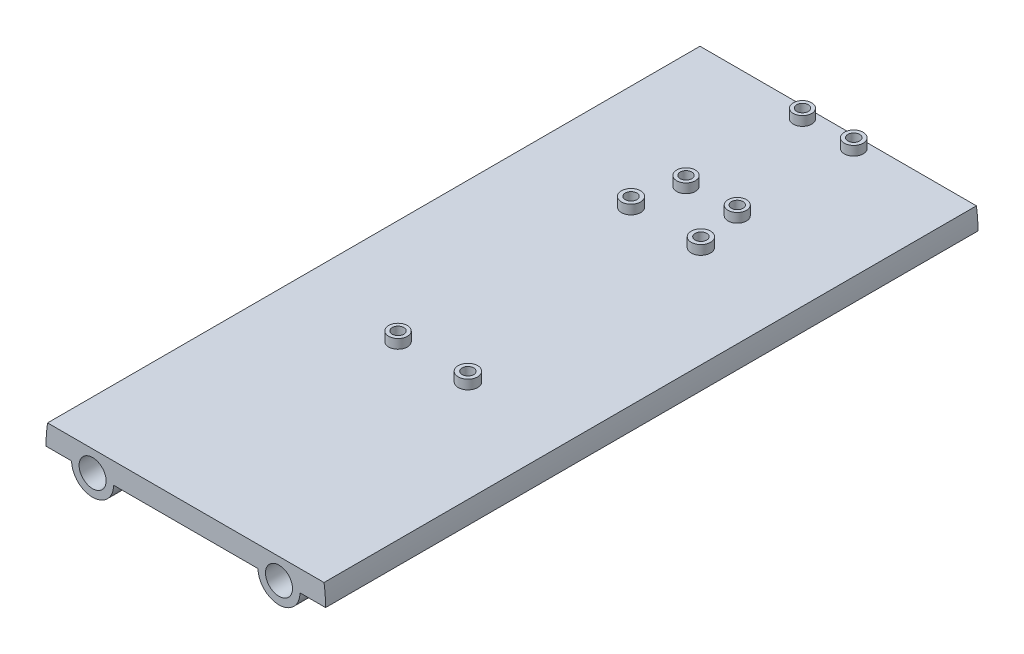
ISO-10303-21;
HEADER;
FILE_DESCRIPTION(('STEP AP214'),'2;1');
FILE_NAME('part.step','',(''),(''),'','','');
FILE_SCHEMA(('AUTOMOTIVE_DESIGN { 1 0 10303 214 1 1 1 1 }'));
ENDSEC;
DATA;
#1=APPLICATION_CONTEXT('core data for automotive mechanical design processes');
#2=APPLICATION_PROTOCOL_DEFINITION('international standard','automotive_design',2000,#1);
#3=PRODUCT_CONTEXT('',#1,'mechanical');
#4=PRODUCT('Part','Part','',(#3));
#5=PRODUCT_RELATED_PRODUCT_CATEGORY('part','',(#4));
#6=PRODUCT_DEFINITION_FORMATION('','',#4);
#7=PRODUCT_DEFINITION_CONTEXT('part definition',#1,'design');
#8=PRODUCT_DEFINITION('design','',#6,#7);
#9=PRODUCT_DEFINITION_SHAPE('','',#8);
#10=(LENGTH_UNIT() NAMED_UNIT(*) SI_UNIT(.MILLI.,.METRE.));
#11=(NAMED_UNIT(*) PLANE_ANGLE_UNIT() SI_UNIT($,.RADIAN.));
#12=(NAMED_UNIT(*) SI_UNIT($,.STERADIAN.) SOLID_ANGLE_UNIT());
#13=UNCERTAINTY_MEASURE_WITH_UNIT(LENGTH_MEASURE(1.E-05),#10,'distance_accuracy_value','');
#14=(GEOMETRIC_REPRESENTATION_CONTEXT(3) GLOBAL_UNCERTAINTY_ASSIGNED_CONTEXT((#13)) GLOBAL_UNIT_ASSIGNED_CONTEXT((#10,
#11,#12)) REPRESENTATION_CONTEXT('',''));
#15=CARTESIAN_POINT('',(0.,0.,0.));
#16=DIRECTION('',(0.,0.,1.));
#17=DIRECTION('',(1.,0.,0.));
#18=AXIS2_PLACEMENT_3D('',#15,#16,#17);
#19=CARTESIAN_POINT('',(0.,5.715,177.8));
#20=DIRECTION('',(0.,1.,0.));
#21=DIRECTION('',(0.,0.,1.));
#22=AXIS2_PLACEMENT_3D('',#19,#20,#21);
#23=PLANE('',#22);
#24=CARTESIAN_POINT('',(9.95606352709171,5.715,110.868407893339));
#25=DIRECTION('',(0.,1.,0.));
#26=DIRECTION('',(0.,0.,1.));
#27=AXIS2_PLACEMENT_3D('',#24,#25,#26);
#28=CIRCLE('',#27,2.64811546342611);
#29=CARTESIAN_POINT('',(9.95606352709171,5.715,113.516523356765));
#30=VERTEX_POINT('',#29);
#31=EDGE_CURVE('E764',#30,#30,#28,.T.);
#32=ORIENTED_EDGE('',*,*,#31,.F.);
#33=EDGE_LOOP('',(#32));
#34=FACE_BOUND('',#33,.T.);
#35=CARTESIAN_POINT('',(-9.0939364729083,5.715,47.3684078933385));
#36=DIRECTION('',(0.,1.,0.));
#37=DIRECTION('',(0.,0.,1.));
#38=AXIS2_PLACEMENT_3D('',#35,#36,#37);
#39=CIRCLE('',#38,2.61887139710482);
#40=CARTESIAN_POINT('',(-9.0939364729083,5.715,49.9872792904434));
#41=VERTEX_POINT('',#40);
#42=EDGE_CURVE('E689',#41,#41,#39,.T.);
#43=ORIENTED_EDGE('',*,*,#42,.F.);
#44=EDGE_LOOP('',(#43));
#45=FACE_BOUND('',#44,.T.);
#46=CARTESIAN_POINT('',(7.41606352709171,5.715,34.925));
#47=DIRECTION('',(0.,1.,0.));
#48=DIRECTION('',(0.,0.,1.));
#49=AXIS2_PLACEMENT_3D('',#46,#47,#48);
#50=CIRCLE('',#49,2.51362900763167);
#51=CARTESIAN_POINT('',(7.41606352709171,5.715,37.4386290076317));
#52=VERTEX_POINT('',#51);
#53=EDGE_CURVE('E712',#52,#52,#50,.T.);
#54=ORIENTED_EDGE('',*,*,#53,.F.);
#55=EDGE_LOOP('',(#54));
#56=FACE_BOUND('',#55,.T.);
#57=CARTESIAN_POINT('',(-6.55393647290829,5.715,3.175));
#58=DIRECTION('',(0.,1.,0.));
#59=DIRECTION('',(0.,0.,1.));
#60=AXIS2_PLACEMENT_3D('',#57,#58,#59);
#61=CIRCLE('',#60,2.52165413075515);
#62=CARTESIAN_POINT('',(-6.55393647290829,5.715,5.69665413075515));
#63=VERTEX_POINT('',#62);
#64=EDGE_CURVE('E247',#63,#63,#61,.T.);
#65=ORIENTED_EDGE('',*,*,#64,.F.);
#66=EDGE_LOOP('',(#65));
#67=FACE_BOUND('',#66,.T.);
#68=DIRECTION('',(1.,0.,0.));
#69=VECTOR('',#68,1.);
#70=CARTESIAN_POINT('',(0.,5.715,0.));
#71=LINE('',#70,#69);
#72=CARTESIAN_POINT('',(-37.6689364729083,5.715,0.));
#73=VERTEX_POINT('',#72);
#74=CARTESIAN_POINT('',(37.6689364729083,5.715,0.));
#75=VERTEX_POINT('',#74);
#76=EDGE_CURVE('E173',#73,#75,#71,.T.);
#77=ORIENTED_EDGE('',*,*,#76,.F.);
#78=DIRECTION('',(0.,0.,-1.));
#79=VECTOR('',#78,1.);
#80=CARTESIAN_POINT('',(-37.6689364729083,5.715,177.8));
#81=LINE('',#80,#79);
#82=CARTESIAN_POINT('',(-37.6689364729083,5.715,177.8));
#83=VERTEX_POINT('',#82);
#84=EDGE_CURVE('E140',#83,#73,#81,.T.);
#85=ORIENTED_EDGE('',*,*,#84,.F.);
#86=DIRECTION('',(1.,0.,0.));
#87=VECTOR('',#86,1.);
#88=CARTESIAN_POINT('',(0.,5.715,177.8));
#89=LINE('',#88,#87);
#90=CARTESIAN_POINT('',(37.6689364729083,5.715,177.8));
#91=VERTEX_POINT('',#90);
#92=EDGE_CURVE('E127',#83,#91,#89,.T.);
#93=ORIENTED_EDGE('',*,*,#92,.T.);
#94=DIRECTION('',(0.,0.,-1.));
#95=VECTOR('',#94,1.);
#96=CARTESIAN_POINT('',(37.6689364729083,5.715,177.8));
#97=LINE('',#96,#95);
#98=EDGE_CURVE('E199',#91,#75,#97,.T.);
#99=ORIENTED_EDGE('',*,*,#98,.T.);
#100=EDGE_LOOP('',(#77,#85,#93,#99));
#101=FACE_BOUND('',#100,.T.);
#102=CARTESIAN_POINT('',(7.41606352709171,5.715,3.175));
#103=DIRECTION('',(0.,1.,0.));
#104=DIRECTION('',(0.,0.,1.));
#105=AXIS2_PLACEMENT_3D('',#102,#103,#104);
#106=CIRCLE('',#105,2.58062274655954);
#107=CARTESIAN_POINT('',(7.41606352709171,5.715,5.75562274655954));
#108=VERTEX_POINT('',#107);
#109=EDGE_CURVE('E700',#108,#108,#106,.T.);
#110=ORIENTED_EDGE('',*,*,#109,.F.);
#111=EDGE_LOOP('',(#110));
#112=FACE_BOUND('',#111,.T.);
#113=CARTESIAN_POINT('',(-6.55393647290829,5.715,34.925));
#114=DIRECTION('',(0.,1.,0.));
#115=DIRECTION('',(0.,0.,1.));
#116=AXIS2_PLACEMENT_3D('',#113,#114,#115);
#117=CIRCLE('',#116,2.53806636988241);
#118=CARTESIAN_POINT('',(-6.55393647290829,5.715,37.4630663698824));
#119=VERTEX_POINT('',#118);
#120=EDGE_CURVE('E229',#119,#119,#117,.T.);
#121=ORIENTED_EDGE('',*,*,#120,.F.);
#122=EDGE_LOOP('',(#121));
#123=FACE_BOUND('',#122,.T.);
#124=CARTESIAN_POINT('',(9.9560635270917,5.715,47.3684078933385));
#125=DIRECTION('',(0.,1.,0.));
#126=DIRECTION('',(0.,0.,1.));
#127=AXIS2_PLACEMENT_3D('',#124,#125,#126);
#128=CIRCLE('',#127,2.63950975718497);
#129=CARTESIAN_POINT('',(9.9560635270917,5.715,50.0079176505235));
#130=VERTEX_POINT('',#129);
#131=EDGE_CURVE('E742',#130,#130,#128,.T.);
#132=ORIENTED_EDGE('',*,*,#131,.F.);
#133=EDGE_LOOP('',(#132));
#134=FACE_BOUND('',#133,.T.);
#135=CARTESIAN_POINT('',(-9.09393647290829,5.715,110.868407893339));
#136=DIRECTION('',(0.,1.,0.));
#137=DIRECTION('',(0.,0.,1.));
#138=AXIS2_PLACEMENT_3D('',#135,#136,#137);
#139=CIRCLE('',#138,2.55019015186236);
#140=CARTESIAN_POINT('',(-9.09393647290829,5.715,113.418598045201));
#141=VERTEX_POINT('',#140);
#142=EDGE_CURVE('E745',#141,#141,#139,.T.);
#143=ORIENTED_EDGE('',*,*,#142,.F.);
#144=EDGE_LOOP('',(#143));
#145=FACE_BOUND('',#144,.T.);
#146=ADVANCED_FACE('F47',(#34,#45,#56,#67,#101,#112,#123,#134,#145),#23,.T.);
#147=CARTESIAN_POINT('',(0.,0.,177.8));
#148=DIRECTION('',(0.,1.,0.));
#149=DIRECTION('',(0.,0.,1.));
#150=AXIS2_PLACEMENT_3D('',#147,#148,#149);
#151=PLANE('',#150);
#152=CARTESIAN_POINT('',(-9.09393647290829,0.,110.868407893339));
#153=DIRECTION('',(0.,1.,0.));
#154=DIRECTION('',(0.,0.,1.));
#155=AXIS2_PLACEMENT_3D('',#152,#153,#154);
#156=CIRCLE('',#155,1.5875);
#157=CARTESIAN_POINT('',(-9.09393647290829,0.,112.455907893339));
#158=VERTEX_POINT('',#157);
#159=EDGE_CURVE('E51',#158,#158,#156,.T.);
#160=ORIENTED_EDGE('',*,*,#159,.T.);
#161=EDGE_LOOP('',(#160));
#162=FACE_BOUND('',#161,.T.);
#163=CARTESIAN_POINT('',(9.95606352709171,0.,110.868407893339));
#164=DIRECTION('',(0.,1.,0.));
#165=DIRECTION('',(0.,0.,1.));
#166=AXIS2_PLACEMENT_3D('',#163,#164,#165);
#167=CIRCLE('',#166,1.5875);
#168=CARTESIAN_POINT('',(9.95606352709171,0.,112.455907893339));
#169=VERTEX_POINT('',#168);
#170=EDGE_CURVE('E217',#169,#169,#167,.T.);
#171=ORIENTED_EDGE('',*,*,#170,.T.);
#172=EDGE_LOOP('',(#171));
#173=FACE_BOUND('',#172,.T.);
#174=CARTESIAN_POINT('',(9.9560635270917,0.,47.3684078933385));
#175=DIRECTION('',(0.,1.,0.));
#176=DIRECTION('',(0.,0.,1.));
#177=AXIS2_PLACEMENT_3D('',#174,#175,#176);
#178=CIRCLE('',#177,1.5875);
#179=CARTESIAN_POINT('',(9.9560635270917,0.,48.9559078933385));
#180=VERTEX_POINT('',#179);
#181=EDGE_CURVE('E213',#180,#180,#178,.T.);
#182=ORIENTED_EDGE('',*,*,#181,.T.);
#183=EDGE_LOOP('',(#182));
#184=FACE_BOUND('',#183,.T.);
#185=CARTESIAN_POINT('',(-9.0939364729083,0.,47.3684078933385));
#186=DIRECTION('',(0.,1.,0.));
#187=DIRECTION('',(0.,0.,1.));
#188=AXIS2_PLACEMENT_3D('',#185,#186,#187);
#189=CIRCLE('',#188,1.5875);
#190=CARTESIAN_POINT('',(-9.0939364729083,0.,48.9559078933385));
#191=VERTEX_POINT('',#190);
#192=EDGE_CURVE('E209',#191,#191,#189,.T.);
#193=ORIENTED_EDGE('',*,*,#192,.T.);
#194=EDGE_LOOP('',(#193));
#195=FACE_BOUND('',#194,.T.);
#196=CARTESIAN_POINT('',(7.41606352709171,0.,3.175));
#197=DIRECTION('',(0.,1.,0.));
#198=DIRECTION('',(0.,0.,1.));
#199=AXIS2_PLACEMENT_3D('',#196,#197,#198);
#200=CIRCLE('',#199,1.5875);
#201=CARTESIAN_POINT('',(7.41606352709171,0.,4.7625));
#202=VERTEX_POINT('',#201);
#203=EDGE_CURVE('E163',#202,#202,#200,.T.);
#204=ORIENTED_EDGE('',*,*,#203,.T.);
#205=EDGE_LOOP('',(#204));
#206=FACE_BOUND('',#205,.T.);
#207=CARTESIAN_POINT('',(-6.55393647290829,0.,34.925));
#208=DIRECTION('',(0.,1.,0.));
#209=DIRECTION('',(0.,0.,1.));
#210=AXIS2_PLACEMENT_3D('',#207,#208,#209);
#211=CIRCLE('',#210,1.5875);
#212=CARTESIAN_POINT('',(-6.55393647290829,0.,36.5125));
#213=VERTEX_POINT('',#212);
#214=EDGE_CURVE('E264',#213,#213,#211,.T.);
#215=ORIENTED_EDGE('',*,*,#214,.T.);
#216=EDGE_LOOP('',(#215));
#217=FACE_BOUND('',#216,.T.);
#218=CARTESIAN_POINT('',(7.41606352709171,0.,34.925));
#219=DIRECTION('',(0.,1.,0.));
#220=DIRECTION('',(0.,0.,1.));
#221=AXIS2_PLACEMENT_3D('',#218,#219,#220);
#222=CIRCLE('',#221,1.5875);
#223=CARTESIAN_POINT('',(7.41606352709171,0.,36.5125));
#224=VERTEX_POINT('',#223);
#225=EDGE_CURVE('E260',#224,#224,#222,.T.);
#226=ORIENTED_EDGE('',*,*,#225,.T.);
#227=EDGE_LOOP('',(#226));
#228=FACE_BOUND('',#227,.T.);
#229=CARTESIAN_POINT('',(-6.55393647290829,0.,3.175));
#230=DIRECTION('',(0.,1.,0.));
#231=DIRECTION('',(0.,0.,1.));
#232=AXIS2_PLACEMENT_3D('',#229,#230,#231);
#233=CIRCLE('',#232,1.5875);
#234=CARTESIAN_POINT('',(-6.55393647290829,0.,4.7625));
#235=VERTEX_POINT('',#234);
#236=EDGE_CURVE('E253',#235,#235,#233,.T.);
#237=ORIENTED_EDGE('',*,*,#236,.T.);
#238=EDGE_LOOP('',(#237));
#239=FACE_BOUND('',#238,.T.);
#240=DIRECTION('',(1.,0.,0.));
#241=VECTOR('',#240,1.);
#242=CARTESIAN_POINT('',(0.,0.,0.));
#243=LINE('',#242,#241);
#244=CARTESIAN_POINT('',(-19.685,0.,0.));
#245=VERTEX_POINT('',#244);
#246=CARTESIAN_POINT('',(19.685,0.,0.));
#247=VERTEX_POINT('',#246);
#248=EDGE_CURVE('E158',#245,#247,#243,.T.);
#249=ORIENTED_EDGE('',*,*,#248,.T.);
#250=DIRECTION('',(0.,0.,-1.));
#251=VECTOR('',#250,1.);
#252=CARTESIAN_POINT('',(19.685,0.,177.8));
#253=LINE('',#252,#251);
#254=CARTESIAN_POINT('',(19.685,0.,177.8));
#255=VERTEX_POINT('',#254);
#256=EDGE_CURVE('E11',#255,#247,#253,.T.);
#257=ORIENTED_EDGE('',*,*,#256,.F.);
#258=DIRECTION('',(1.,0.,0.));
#259=VECTOR('',#258,1.);
#260=CARTESIAN_POINT('',(0.,0.,177.8));
#261=LINE('',#260,#259);
#262=CARTESIAN_POINT('',(-19.685,0.,177.8));
#263=VERTEX_POINT('',#262);
#264=EDGE_CURVE('E192',#263,#255,#261,.T.);
#265=ORIENTED_EDGE('',*,*,#264,.F.);
#266=DIRECTION('',(0.,0.,-1.));
#267=VECTOR('',#266,1.);
#268=CARTESIAN_POINT('',(-19.685,0.,177.8));
#269=LINE('',#268,#267);
#270=EDGE_CURVE('E157',#263,#245,#269,.T.);
#271=ORIENTED_EDGE('',*,*,#270,.T.);
#272=EDGE_LOOP('',(#249,#257,#265,#271));
#273=FACE_BOUND('',#272,.T.);
#274=ADVANCED_FACE('F49',(#162,#173,#184,#195,#206,#217,#228,#239,#273),#151,.F.);
#275=CARTESIAN_POINT('',(25.4,0.,177.8));
#276=DIRECTION('',(0.,0.,-1.));
#277=DIRECTION('',(-1.,0.,0.));
#278=AXIS2_PLACEMENT_3D('',#275,#276,#277);
#279=CYLINDRICAL_SURFACE('',#278,5.715);
#280=CARTESIAN_POINT('',(25.4,0.,0.));
#281=DIRECTION('',(0.,0.,1.));
#282=DIRECTION('',(1.,0.,0.));
#283=AXIS2_PLACEMENT_3D('',#280,#281,#282);
#284=CIRCLE('',#283,5.715);
#285=CARTESIAN_POINT('',(31.115,0.,0.));
#286=VERTEX_POINT('',#285);
#287=EDGE_CURVE('E162',#247,#286,#284,.T.);
#288=ORIENTED_EDGE('',*,*,#287,.T.);
#289=DIRECTION('',(0.,0.,-1.));
#290=VECTOR('',#289,1.);
#291=CARTESIAN_POINT('',(31.115,0.,177.8));
#292=LINE('',#291,#290);
#293=CARTESIAN_POINT('',(31.115,0.,177.8));
#294=VERTEX_POINT('',#293);
#295=EDGE_CURVE('E58',#294,#286,#292,.T.);
#296=ORIENTED_EDGE('',*,*,#295,.F.);
#297=CARTESIAN_POINT('',(25.4,0.,177.8));
#298=DIRECTION('',(0.,0.,1.));
#299=DIRECTION('',(1.,0.,0.));
#300=AXIS2_PLACEMENT_3D('',#297,#298,#299);
#301=CIRCLE('',#300,5.715);
#302=EDGE_CURVE('E106',#255,#294,#301,.T.);
#303=ORIENTED_EDGE('',*,*,#302,.F.);
#304=ORIENTED_EDGE('',*,*,#256,.T.);
#305=EDGE_LOOP('',(#288,#296,#303,#304));
#306=FACE_BOUND('',#305,.T.);
#307=ADVANCED_FACE('F315',(#306),#279,.T.);
#308=CARTESIAN_POINT('',(0.,0.,177.8));
#309=DIRECTION('',(0.,1.,0.));
#310=DIRECTION('',(0.,0.,1.));
#311=AXIS2_PLACEMENT_3D('',#308,#309,#310);
#312=PLANE('',#311);
#313=DIRECTION('',(1.,0.,0.));
#314=VECTOR('',#313,1.);
#315=CARTESIAN_POINT('',(0.,0.,0.));
#316=LINE('',#315,#314);
#317=CARTESIAN_POINT('',(38.1,0.,0.));
#318=VERTEX_POINT('',#317);
#319=EDGE_CURVE('E166',#286,#318,#316,.T.);
#320=ORIENTED_EDGE('',*,*,#319,.T.);
#321=DIRECTION('',(0.,0.,-1.));
#322=VECTOR('',#321,1.);
#323=CARTESIAN_POINT('',(38.1,0.,177.8));
#324=LINE('',#323,#322);
#325=CARTESIAN_POINT('',(38.1,0.,177.8));
#326=VERTEX_POINT('',#325);
#327=EDGE_CURVE('E202',#326,#318,#324,.T.);
#328=ORIENTED_EDGE('',*,*,#327,.F.);
#329=DIRECTION('',(1.,0.,0.));
#330=VECTOR('',#329,1.);
#331=CARTESIAN_POINT('',(0.,0.,177.8));
#332=LINE('',#331,#330);
#333=EDGE_CURVE('E275',#294,#326,#332,.T.);
#334=ORIENTED_EDGE('',*,*,#333,.F.);
#335=ORIENTED_EDGE('',*,*,#295,.T.);
#336=EDGE_LOOP('',(#320,#328,#334,#335));
#337=FACE_BOUND('',#336,.T.);
#338=ADVANCED_FACE('F323',(#337),#312,.F.);
#339=CARTESIAN_POINT('',(0.,0.,177.8));
#340=DIRECTION('',(0.,0.,-1.));
#341=DIRECTION('',(-1.,0.,0.));
#342=AXIS2_PLACEMENT_3D('',#339,#340,#341);
#343=CYLINDRICAL_SURFACE('',#342,38.1);
#344=CARTESIAN_POINT('',(0.,0.,0.));
#345=DIRECTION('',(0.,0.,1.));
#346=DIRECTION('',(1.,0.,0.));
#347=AXIS2_PLACEMENT_3D('',#344,#345,#346);
#348=CIRCLE('',#347,38.1);
#349=EDGE_CURVE('E169',#318,#75,#348,.T.);
#350=ORIENTED_EDGE('',*,*,#349,.T.);
#351=ORIENTED_EDGE('',*,*,#98,.F.);
#352=CARTESIAN_POINT('',(0.,0.,177.8));
#353=DIRECTION('',(0.,0.,1.));
#354=DIRECTION('',(1.,0.,0.));
#355=AXIS2_PLACEMENT_3D('',#352,#353,#354);
#356=CIRCLE('',#355,38.1);
#357=EDGE_CURVE('E278',#326,#91,#356,.T.);
#358=ORIENTED_EDGE('',*,*,#357,.F.);
#359=ORIENTED_EDGE('',*,*,#327,.T.);
#360=EDGE_LOOP('',(#350,#351,#358,#359));
#361=FACE_BOUND('',#360,.T.);
#362=ADVANCED_FACE('F320',(#361),#343,.T.);
#363=CARTESIAN_POINT('',(0.,0.,177.8));
#364=DIRECTION('',(0.,0.,-1.));
#365=DIRECTION('',(-1.,0.,0.));
#366=AXIS2_PLACEMENT_3D('',#363,#364,#365);
#367=CYLINDRICAL_SURFACE('',#366,38.1);
#368=CARTESIAN_POINT('',(0.,0.,0.));
#369=DIRECTION('',(0.,0.,1.));
#370=DIRECTION('',(1.,0.,0.));
#371=AXIS2_PLACEMENT_3D('',#368,#369,#370);
#372=CIRCLE('',#371,38.1);
#373=CARTESIAN_POINT('',(-38.1,0.,0.));
#374=VERTEX_POINT('',#373);
#375=EDGE_CURVE('E135',#73,#374,#372,.T.);
#376=ORIENTED_EDGE('',*,*,#375,.T.);
#377=DIRECTION('',(0.,0.,-1.));
#378=VECTOR('',#377,1.);
#379=CARTESIAN_POINT('',(-38.1,0.,177.8));
#380=LINE('',#379,#378);
#381=CARTESIAN_POINT('',(-38.1,0.,177.8));
#382=VERTEX_POINT('',#381);
#383=EDGE_CURVE('E132',#382,#374,#380,.T.);
#384=ORIENTED_EDGE('',*,*,#383,.F.);
#385=CARTESIAN_POINT('',(0.,0.,177.8));
#386=DIRECTION('',(0.,0.,1.));
#387=DIRECTION('',(1.,0.,0.));
#388=AXIS2_PLACEMENT_3D('',#385,#386,#387);
#389=CIRCLE('',#388,38.1);
#390=EDGE_CURVE('E120',#83,#382,#389,.T.);
#391=ORIENTED_EDGE('',*,*,#390,.F.);
#392=ORIENTED_EDGE('',*,*,#84,.T.);
#393=EDGE_LOOP('',(#376,#384,#391,#392));
#394=FACE_BOUND('',#393,.T.);
#395=ADVANCED_FACE('F133',(#394),#367,.T.);
#396=CARTESIAN_POINT('',(0.,0.,177.8));
#397=DIRECTION('',(0.,-1.,0.));
#398=DIRECTION('',(0.,0.,-1.));
#399=AXIS2_PLACEMENT_3D('',#396,#397,#398);
#400=PLANE('',#399);
#401=DIRECTION('',(-1.,0.,0.));
#402=VECTOR('',#401,1.);
#403=CARTESIAN_POINT('',(0.,0.,0.));
#404=LINE('',#403,#402);
#405=CARTESIAN_POINT('',(-31.115,0.,0.));
#406=VERTEX_POINT('',#405);
#407=EDGE_CURVE('E179',#406,#374,#404,.T.);
#408=ORIENTED_EDGE('',*,*,#407,.F.);
#409=DIRECTION('',(0.,0.,-1.));
#410=VECTOR('',#409,1.);
#411=CARTESIAN_POINT('',(-31.115,0.,177.8));
#412=LINE('',#411,#410);
#413=CARTESIAN_POINT('',(-31.115,0.,177.8));
#414=VERTEX_POINT('',#413);
#415=EDGE_CURVE('E95',#414,#406,#412,.T.);
#416=ORIENTED_EDGE('',*,*,#415,.F.);
#417=DIRECTION('',(-1.,0.,0.));
#418=VECTOR('',#417,1.);
#419=CARTESIAN_POINT('',(0.,0.,177.8));
#420=LINE('',#419,#418);
#421=EDGE_CURVE('E125',#414,#382,#420,.T.);
#422=ORIENTED_EDGE('',*,*,#421,.T.);
#423=ORIENTED_EDGE('',*,*,#383,.T.);
#424=EDGE_LOOP('',(#408,#416,#422,#423));
#425=FACE_BOUND('',#424,.T.);
#426=ADVANCED_FACE('F142',(#425),#400,.T.);
#427=CARTESIAN_POINT('',(-25.4,0.,177.8));
#428=DIRECTION('',(0.,0.,-1.));
#429=DIRECTION('',(-1.,0.,0.));
#430=AXIS2_PLACEMENT_3D('',#427,#428,#429);
#431=CYLINDRICAL_SURFACE('',#430,3.683);
#432=CARTESIAN_POINT('',(-25.4,0.,177.8));
#433=DIRECTION('',(0.,0.,1.));
#434=DIRECTION('',(1.,0.,0.));
#435=AXIS2_PLACEMENT_3D('',#432,#433,#434);
#436=CIRCLE('',#435,3.683);
#437=CARTESIAN_POINT('',(-21.717,0.,177.8));
#438=VERTEX_POINT('',#437);
#439=EDGE_CURVE('E146',#438,#438,#436,.T.);
#440=ORIENTED_EDGE('',*,*,#439,.T.);
#441=EDGE_LOOP('',(#440));
#442=FACE_BOUND('',#441,.T.);
#443=CARTESIAN_POINT('',(-25.4,0.,0.));
#444=DIRECTION('',(0.,0.,1.));
#445=DIRECTION('',(1.,0.,0.));
#446=AXIS2_PLACEMENT_3D('',#443,#444,#445);
#447=CIRCLE('',#446,3.683);
#448=CARTESIAN_POINT('',(-21.717,0.,0.));
#449=VERTEX_POINT('',#448);
#450=EDGE_CURVE('E184',#449,#449,#447,.T.);
#451=ORIENTED_EDGE('',*,*,#450,.F.);
#452=EDGE_LOOP('',(#451));
#453=FACE_BOUND('',#452,.T.);
#454=ADVANCED_FACE('F297',(#442,#453),#431,.F.);
#455=CARTESIAN_POINT('',(-25.4,0.,177.8));
#456=DIRECTION('',(0.,0.,-1.));
#457=DIRECTION('',(-1.,0.,0.));
#458=AXIS2_PLACEMENT_3D('',#455,#456,#457);
#459=CYLINDRICAL_SURFACE('',#458,5.715);
#460=CARTESIAN_POINT('',(-25.4,0.,0.));
#461=DIRECTION('',(0.,0.,1.));
#462=DIRECTION('',(1.,0.,0.));
#463=AXIS2_PLACEMENT_3D('',#460,#461,#462);
#464=CIRCLE('',#463,5.715);
#465=EDGE_CURVE('E98',#406,#245,#464,.T.);
#466=ORIENTED_EDGE('',*,*,#465,.T.);
#467=ORIENTED_EDGE('',*,*,#270,.F.);
#468=CARTESIAN_POINT('',(-25.4,0.,177.8));
#469=DIRECTION('',(0.,0.,1.));
#470=DIRECTION('',(1.,0.,0.));
#471=AXIS2_PLACEMENT_3D('',#468,#469,#470);
#472=CIRCLE('',#471,5.715);
#473=EDGE_CURVE('E67',#414,#263,#472,.T.);
#474=ORIENTED_EDGE('',*,*,#473,.F.);
#475=ORIENTED_EDGE('',*,*,#415,.T.);
#476=EDGE_LOOP('',(#466,#467,#474,#475));
#477=FACE_BOUND('',#476,.T.);
#478=ADVANCED_FACE('F294',(#477),#459,.T.);
#479=CARTESIAN_POINT('',(25.4,0.,177.8));
#480=DIRECTION('',(0.,0.,-1.));
#481=DIRECTION('',(-1.,0.,0.));
#482=AXIS2_PLACEMENT_3D('',#479,#480,#481);
#483=CYLINDRICAL_SURFACE('',#482,3.683);
#484=CARTESIAN_POINT('',(25.4,0.,177.8));
#485=DIRECTION('',(0.,0.,1.));
#486=DIRECTION('',(1.,0.,0.));
#487=AXIS2_PLACEMENT_3D('',#484,#485,#486);
#488=CIRCLE('',#487,3.683);
#489=CARTESIAN_POINT('',(29.083,0.,177.8));
#490=VERTEX_POINT('',#489);
#491=EDGE_CURVE('E153',#490,#490,#488,.T.);
#492=ORIENTED_EDGE('',*,*,#491,.T.);
#493=EDGE_LOOP('',(#492));
#494=FACE_BOUND('',#493,.T.);
#495=CARTESIAN_POINT('',(25.4,0.,0.));
#496=DIRECTION('',(0.,0.,1.));
#497=DIRECTION('',(1.,0.,0.));
#498=AXIS2_PLACEMENT_3D('',#495,#496,#497);
#499=CIRCLE('',#498,3.683);
#500=CARTESIAN_POINT('',(29.083,0.,0.));
#501=VERTEX_POINT('',#500);
#502=EDGE_CURVE('E188',#501,#501,#499,.T.);
#503=ORIENTED_EDGE('',*,*,#502,.F.);
#504=EDGE_LOOP('',(#503));
#505=FACE_BOUND('',#504,.T.);
#506=ADVANCED_FACE('F296',(#494,#505),#483,.F.);
#507=CARTESIAN_POINT('',(0.,0.,177.8));
#508=DIRECTION('',(0.,0.,1.));
#509=DIRECTION('',(1.,0.,0.));
#510=AXIS2_PLACEMENT_3D('',#507,#508,#509);
#511=PLANE('',#510);
#512=ORIENTED_EDGE('',*,*,#264,.T.);
#513=ORIENTED_EDGE('',*,*,#302,.T.);
#514=ORIENTED_EDGE('',*,*,#333,.T.);
#515=ORIENTED_EDGE('',*,*,#357,.T.);
#516=ORIENTED_EDGE('',*,*,#92,.F.);
#517=ORIENTED_EDGE('',*,*,#390,.T.);
#518=ORIENTED_EDGE('',*,*,#421,.F.);
#519=ORIENTED_EDGE('',*,*,#473,.T.);
#520=EDGE_LOOP('',(#512,#513,#514,#515,#516,#517,#518,#519));
#521=FACE_BOUND('',#520,.T.);
#522=ORIENTED_EDGE('',*,*,#439,.F.);
#523=EDGE_LOOP('',(#522));
#524=FACE_BOUND('',#523,.T.);
#525=ORIENTED_EDGE('',*,*,#491,.F.);
#526=EDGE_LOOP('',(#525));
#527=FACE_BOUND('',#526,.T.);
#528=ADVANCED_FACE('F122',(#521,#524,#527),#511,.T.);
#529=CARTESIAN_POINT('',(0.,0.,0.));
#530=DIRECTION('',(0.,0.,1.));
#531=DIRECTION('',(1.,0.,0.));
#532=AXIS2_PLACEMENT_3D('',#529,#530,#531);
#533=PLANE('',#532);
#534=ORIENTED_EDGE('',*,*,#248,.F.);
#535=ORIENTED_EDGE('',*,*,#465,.F.);
#536=ORIENTED_EDGE('',*,*,#407,.T.);
#537=ORIENTED_EDGE('',*,*,#375,.F.);
#538=ORIENTED_EDGE('',*,*,#76,.T.);
#539=ORIENTED_EDGE('',*,*,#349,.F.);
#540=ORIENTED_EDGE('',*,*,#319,.F.);
#541=ORIENTED_EDGE('',*,*,#287,.F.);
#542=EDGE_LOOP('',(#534,#535,#536,#537,#538,#539,#540,#541));
#543=FACE_BOUND('',#542,.T.);
#544=ORIENTED_EDGE('',*,*,#450,.T.);
#545=EDGE_LOOP('',(#544));
#546=FACE_BOUND('',#545,.T.);
#547=ORIENTED_EDGE('',*,*,#502,.T.);
#548=EDGE_LOOP('',(#547));
#549=FACE_BOUND('',#548,.T.);
#550=ADVANCED_FACE('F287',(#543,#546,#549),#533,.F.);
#551=CARTESIAN_POINT('',(-6.55393647290829,-5.715,3.175));
#552=DIRECTION('',(0.,1.,0.));
#553=DIRECTION('',(0.,0.,1.));
#554=AXIS2_PLACEMENT_3D('',#551,#552,#553);
#555=CYLINDRICAL_SURFACE('',#554,1.5875);
#556=ORIENTED_EDGE('',*,*,#236,.F.);
#557=EDGE_LOOP('',(#556));
#558=FACE_BOUND('',#557,.T.);
#559=CARTESIAN_POINT('',(-6.55393647290829,8.255,3.175));
#560=DIRECTION('',(0.,1.,0.));
#561=DIRECTION('',(0.,0.,1.));
#562=AXIS2_PLACEMENT_3D('',#559,#560,#561);
#563=CIRCLE('',#562,1.5875);
#564=CARTESIAN_POINT('',(-6.55393647290829,8.255,4.7625));
#565=VERTEX_POINT('',#564);
#566=EDGE_CURVE('E243',#565,#565,#563,.T.);
#567=ORIENTED_EDGE('',*,*,#566,.T.);
#568=EDGE_LOOP('',(#567));
#569=FACE_BOUND('',#568,.T.);
#570=ADVANCED_FACE('F401',(#558,#569),#555,.F.);
#571=CARTESIAN_POINT('',(7.41606352709171,-5.715,34.925));
#572=DIRECTION('',(0.,1.,0.));
#573=DIRECTION('',(0.,0.,1.));
#574=AXIS2_PLACEMENT_3D('',#571,#572,#573);
#575=CYLINDRICAL_SURFACE('',#574,1.5875);
#576=ORIENTED_EDGE('',*,*,#225,.F.);
#577=EDGE_LOOP('',(#576));
#578=FACE_BOUND('',#577,.T.);
#579=CARTESIAN_POINT('',(7.41606352709171,8.255,34.925));
#580=DIRECTION('',(0.,1.,0.));
#581=DIRECTION('',(0.,0.,1.));
#582=AXIS2_PLACEMENT_3D('',#579,#580,#581);
#583=CIRCLE('',#582,1.5875);
#584=CARTESIAN_POINT('',(7.41606352709171,8.255,36.5125));
#585=VERTEX_POINT('',#584);
#586=EDGE_CURVE('E708',#585,#585,#583,.T.);
#587=ORIENTED_EDGE('',*,*,#586,.T.);
#588=EDGE_LOOP('',(#587));
#589=FACE_BOUND('',#588,.T.);
#590=ADVANCED_FACE('F423',(#578,#589),#575,.F.);
#591=CARTESIAN_POINT('',(-6.55393647290829,-5.715,34.925));
#592=DIRECTION('',(0.,1.,0.));
#593=DIRECTION('',(0.,0.,1.));
#594=AXIS2_PLACEMENT_3D('',#591,#592,#593);
#595=CYLINDRICAL_SURFACE('',#594,1.5875);
#596=ORIENTED_EDGE('',*,*,#214,.F.);
#597=EDGE_LOOP('',(#596));
#598=FACE_BOUND('',#597,.T.);
#599=CARTESIAN_POINT('',(-6.55393647290829,8.255,34.925));
#600=DIRECTION('',(0.,1.,0.));
#601=DIRECTION('',(0.,0.,1.));
#602=AXIS2_PLACEMENT_3D('',#599,#600,#601);
#603=CIRCLE('',#602,1.5875);
#604=CARTESIAN_POINT('',(-6.55393647290829,8.255,36.5125));
#605=VERTEX_POINT('',#604);
#606=EDGE_CURVE('E235',#605,#605,#603,.T.);
#607=ORIENTED_EDGE('',*,*,#606,.T.);
#608=EDGE_LOOP('',(#607));
#609=FACE_BOUND('',#608,.T.);
#610=ADVANCED_FACE('F436',(#598,#609),#595,.F.);
#611=CARTESIAN_POINT('',(7.41606352709171,-5.715,3.175));
#612=DIRECTION('',(0.,1.,0.));
#613=DIRECTION('',(0.,0.,1.));
#614=AXIS2_PLACEMENT_3D('',#611,#612,#613);
#615=CYLINDRICAL_SURFACE('',#614,1.5875);
#616=ORIENTED_EDGE('',*,*,#203,.F.);
#617=EDGE_LOOP('',(#616));
#618=FACE_BOUND('',#617,.T.);
#619=CARTESIAN_POINT('',(7.41606352709171,8.255,3.175));
#620=DIRECTION('',(0.,1.,0.));
#621=DIRECTION('',(0.,0.,1.));
#622=AXIS2_PLACEMENT_3D('',#619,#620,#621);
#623=CIRCLE('',#622,1.5875);
#624=CARTESIAN_POINT('',(7.41606352709171,8.255,4.7625));
#625=VERTEX_POINT('',#624);
#626=EDGE_CURVE('E248',#625,#625,#623,.T.);
#627=ORIENTED_EDGE('',*,*,#626,.T.);
#628=EDGE_LOOP('',(#627));
#629=FACE_BOUND('',#628,.T.);
#630=ADVANCED_FACE('F447',(#618,#629),#615,.F.);
#631=CARTESIAN_POINT('',(7.41606352709171,8.255,3.175));
#632=DIRECTION('',(0.,1.,0.));
#633=DIRECTION('',(0.,0.,1.));
#634=AXIS2_PLACEMENT_3D('',#631,#632,#633);
#635=PLANE('',#634);
#636=CARTESIAN_POINT('',(7.41606352709171,8.255,3.175));
#637=DIRECTION('',(0.,1.,0.));
#638=DIRECTION('',(0.,0.,1.));
#639=AXIS2_PLACEMENT_3D('',#636,#637,#638);
#640=CIRCLE('',#639,2.58062274655954);
#641=CARTESIAN_POINT('',(7.41606352709171,8.255,5.75562274655954));
#642=VERTEX_POINT('',#641);
#643=EDGE_CURVE('E704',#642,#642,#640,.T.);
#644=ORIENTED_EDGE('',*,*,#643,.T.);
#645=EDGE_LOOP('',(#644));
#646=FACE_BOUND('',#645,.T.);
#647=ORIENTED_EDGE('',*,*,#626,.F.);
#648=EDGE_LOOP('',(#647));
#649=FACE_BOUND('',#648,.T.);
#650=ADVANCED_FACE('F458',(#646,#649),#635,.T.);
#651=CARTESIAN_POINT('',(7.41606352709171,8.255,3.175));
#652=DIRECTION('',(0.,-1.,0.));
#653=DIRECTION('',(0.,0.,-1.));
#654=AXIS2_PLACEMENT_3D('',#651,#652,#653);
#655=CYLINDRICAL_SURFACE('',#654,2.58062274655954);
#656=ORIENTED_EDGE('',*,*,#643,.F.);
#657=EDGE_LOOP('',(#656));
#658=FACE_BOUND('',#657,.T.);
#659=ORIENTED_EDGE('',*,*,#109,.T.);
#660=EDGE_LOOP('',(#659));
#661=FACE_BOUND('',#660,.T.);
#662=ADVANCED_FACE('F471',(#658,#661),#655,.T.);
#663=CARTESIAN_POINT('',(-6.55393647290829,8.255,34.925));
#664=DIRECTION('',(0.,1.,0.));
#665=DIRECTION('',(0.,0.,1.));
#666=AXIS2_PLACEMENT_3D('',#663,#664,#665);
#667=PLANE('',#666);
#668=CARTESIAN_POINT('',(-6.55393647290829,8.255,34.925));
#669=DIRECTION('',(0.,1.,0.));
#670=DIRECTION('',(0.,0.,1.));
#671=AXIS2_PLACEMENT_3D('',#668,#669,#670);
#672=CIRCLE('',#671,2.53806636988241);
#673=CARTESIAN_POINT('',(-6.55393647290829,8.255,37.4630663698824));
#674=VERTEX_POINT('',#673);
#675=EDGE_CURVE('E224',#674,#674,#672,.T.);
#676=ORIENTED_EDGE('',*,*,#675,.T.);
#677=EDGE_LOOP('',(#676));
#678=FACE_BOUND('',#677,.T.);
#679=ORIENTED_EDGE('',*,*,#606,.F.);
#680=EDGE_LOOP('',(#679));
#681=FACE_BOUND('',#680,.T.);
#682=ADVANCED_FACE('F481',(#678,#681),#667,.T.);
#683=CARTESIAN_POINT('',(-6.55393647290829,8.255,34.925));
#684=DIRECTION('',(0.,-1.,0.));
#685=DIRECTION('',(0.,0.,-1.));
#686=AXIS2_PLACEMENT_3D('',#683,#684,#685);
#687=CYLINDRICAL_SURFACE('',#686,2.53806636988241);
#688=ORIENTED_EDGE('',*,*,#675,.F.);
#689=EDGE_LOOP('',(#688));
#690=FACE_BOUND('',#689,.T.);
#691=ORIENTED_EDGE('',*,*,#120,.T.);
#692=EDGE_LOOP('',(#691));
#693=FACE_BOUND('',#692,.T.);
#694=ADVANCED_FACE('F491',(#690,#693),#687,.T.);
#695=CARTESIAN_POINT('',(7.41606352709171,8.255,34.925));
#696=DIRECTION('',(0.,1.,0.));
#697=DIRECTION('',(0.,0.,1.));
#698=AXIS2_PLACEMENT_3D('',#695,#696,#697);
#699=PLANE('',#698);
#700=CARTESIAN_POINT('',(7.41606352709171,8.255,34.925));
#701=DIRECTION('',(0.,1.,0.));
#702=DIRECTION('',(0.,0.,1.));
#703=AXIS2_PLACEMENT_3D('',#700,#701,#702);
#704=CIRCLE('',#703,2.51362900763167);
#705=CARTESIAN_POINT('',(7.41606352709171,8.255,37.4386290076317));
#706=VERTEX_POINT('',#705);
#707=EDGE_CURVE('E242',#706,#706,#704,.T.);
#708=ORIENTED_EDGE('',*,*,#707,.T.);
#709=EDGE_LOOP('',(#708));
#710=FACE_BOUND('',#709,.T.);
#711=ORIENTED_EDGE('',*,*,#586,.F.);
#712=EDGE_LOOP('',(#711));
#713=FACE_BOUND('',#712,.T.);
#714=ADVANCED_FACE('F500',(#710,#713),#699,.T.);
#715=CARTESIAN_POINT('',(7.41606352709171,8.255,34.925));
#716=DIRECTION('',(0.,-1.,0.));
#717=DIRECTION('',(0.,0.,-1.));
#718=AXIS2_PLACEMENT_3D('',#715,#716,#717);
#719=CYLINDRICAL_SURFACE('',#718,2.51362900763167);
#720=ORIENTED_EDGE('',*,*,#707,.F.);
#721=EDGE_LOOP('',(#720));
#722=FACE_BOUND('',#721,.T.);
#723=ORIENTED_EDGE('',*,*,#53,.T.);
#724=EDGE_LOOP('',(#723));
#725=FACE_BOUND('',#724,.T.);
#726=ADVANCED_FACE('F510',(#722,#725),#719,.T.);
#727=CARTESIAN_POINT('',(-6.55393647290829,8.255,3.175));
#728=DIRECTION('',(0.,1.,0.));
#729=DIRECTION('',(0.,0.,1.));
#730=AXIS2_PLACEMENT_3D('',#727,#728,#729);
#731=PLANE('',#730);
#732=CARTESIAN_POINT('',(-6.55393647290829,8.255,3.175));
#733=DIRECTION('',(0.,1.,0.));
#734=DIRECTION('',(0.,0.,1.));
#735=AXIS2_PLACEMENT_3D('',#732,#733,#734);
#736=CIRCLE('',#735,2.52165413075515);
#737=CARTESIAN_POINT('',(-6.55393647290829,8.255,5.69665413075515));
#738=VERTEX_POINT('',#737);
#739=EDGE_CURVE('E249',#738,#738,#736,.T.);
#740=ORIENTED_EDGE('',*,*,#739,.T.);
#741=EDGE_LOOP('',(#740));
#742=FACE_BOUND('',#741,.T.);
#743=ORIENTED_EDGE('',*,*,#566,.F.);
#744=EDGE_LOOP('',(#743));
#745=FACE_BOUND('',#744,.T.);
#746=ADVANCED_FACE('F520',(#742,#745),#731,.T.);
#747=CARTESIAN_POINT('',(-6.55393647290829,8.255,3.175));
#748=DIRECTION('',(0.,-1.,0.));
#749=DIRECTION('',(0.,0.,-1.));
#750=AXIS2_PLACEMENT_3D('',#747,#748,#749);
#751=CYLINDRICAL_SURFACE('',#750,2.52165413075515);
#752=ORIENTED_EDGE('',*,*,#739,.F.);
#753=EDGE_LOOP('',(#752));
#754=FACE_BOUND('',#753,.T.);
#755=ORIENTED_EDGE('',*,*,#64,.T.);
#756=EDGE_LOOP('',(#755));
#757=FACE_BOUND('',#756,.T.);
#758=ADVANCED_FACE('F530',(#754,#757),#751,.T.);
#759=CARTESIAN_POINT('',(-9.0939364729083,-5.715,47.3684078933385));
#760=DIRECTION('',(0.,1.,0.));
#761=DIRECTION('',(0.,0.,1.));
#762=AXIS2_PLACEMENT_3D('',#759,#760,#761);
#763=CYLINDRICAL_SURFACE('',#762,1.5875);
#764=ORIENTED_EDGE('',*,*,#192,.F.);
#765=EDGE_LOOP('',(#764));
#766=FACE_BOUND('',#765,.T.);
#767=CARTESIAN_POINT('',(-9.0939364729083,8.255,47.3684078933385));
#768=DIRECTION('',(0.,1.,0.));
#769=DIRECTION('',(0.,0.,1.));
#770=AXIS2_PLACEMENT_3D('',#767,#768,#769);
#771=CIRCLE('',#770,1.5875);
#772=CARTESIAN_POINT('',(-9.0939364729083,8.255,48.9559078933385));
#773=VERTEX_POINT('',#772);
#774=EDGE_CURVE('E691',#773,#773,#771,.T.);
#775=ORIENTED_EDGE('',*,*,#774,.T.);
#776=EDGE_LOOP('',(#775));
#777=FACE_BOUND('',#776,.T.);
#778=ADVANCED_FACE('F540',(#766,#777),#763,.F.);
#779=CARTESIAN_POINT('',(9.9560635270917,-5.715,47.3684078933385));
#780=DIRECTION('',(0.,1.,0.));
#781=DIRECTION('',(0.,0.,1.));
#782=AXIS2_PLACEMENT_3D('',#779,#780,#781);
#783=CYLINDRICAL_SURFACE('',#782,1.5875);
#784=ORIENTED_EDGE('',*,*,#181,.F.);
#785=EDGE_LOOP('',(#784));
#786=FACE_BOUND('',#785,.T.);
#787=CARTESIAN_POINT('',(9.9560635270917,8.255,47.3684078933385));
#788=DIRECTION('',(0.,1.,0.));
#789=DIRECTION('',(0.,0.,1.));
#790=AXIS2_PLACEMENT_3D('',#787,#788,#789);
#791=CIRCLE('',#790,1.5875);
#792=CARTESIAN_POINT('',(9.9560635270917,8.255,48.9559078933385));
#793=VERTEX_POINT('',#792);
#794=EDGE_CURVE('E697',#793,#793,#791,.T.);
#795=ORIENTED_EDGE('',*,*,#794,.T.);
#796=EDGE_LOOP('',(#795));
#797=FACE_BOUND('',#796,.T.);
#798=ADVANCED_FACE('F550',(#786,#797),#783,.F.);
#799=CARTESIAN_POINT('',(9.95606352709171,-5.715,110.868407893339));
#800=DIRECTION('',(0.,1.,0.));
#801=DIRECTION('',(0.,0.,1.));
#802=AXIS2_PLACEMENT_3D('',#799,#800,#801);
#803=CYLINDRICAL_SURFACE('',#802,1.5875);
#804=ORIENTED_EDGE('',*,*,#170,.F.);
#805=EDGE_LOOP('',(#804));
#806=FACE_BOUND('',#805,.T.);
#807=CARTESIAN_POINT('',(9.95606352709171,8.255,110.868407893339));
#808=DIRECTION('',(0.,1.,0.));
#809=DIRECTION('',(0.,0.,1.));
#810=AXIS2_PLACEMENT_3D('',#807,#808,#809);
#811=CIRCLE('',#810,1.5875);
#812=CARTESIAN_POINT('',(9.95606352709171,8.255,112.455907893339));
#813=VERTEX_POINT('',#812);
#814=EDGE_CURVE('E759',#813,#813,#811,.T.);
#815=ORIENTED_EDGE('',*,*,#814,.T.);
#816=EDGE_LOOP('',(#815));
#817=FACE_BOUND('',#816,.T.);
#818=ADVANCED_FACE('F562',(#806,#817),#803,.F.);
#819=CARTESIAN_POINT('',(-9.09393647290829,-5.715,110.868407893339));
#820=DIRECTION('',(0.,1.,0.));
#821=DIRECTION('',(0.,0.,1.));
#822=AXIS2_PLACEMENT_3D('',#819,#820,#821);
#823=CYLINDRICAL_SURFACE('',#822,1.5875);
#824=ORIENTED_EDGE('',*,*,#159,.F.);
#825=EDGE_LOOP('',(#824));
#826=FACE_BOUND('',#825,.T.);
#827=CARTESIAN_POINT('',(-9.09393647290829,8.255,110.868407893339));
#828=DIRECTION('',(0.,1.,0.));
#829=DIRECTION('',(0.,0.,1.));
#830=AXIS2_PLACEMENT_3D('',#827,#828,#829);
#831=CIRCLE('',#830,1.58750000000001);
#832=CARTESIAN_POINT('',(-9.09393647290829,8.255,112.455907893339));
#833=VERTEX_POINT('',#832);
#834=EDGE_CURVE('E748',#833,#833,#831,.T.);
#835=ORIENTED_EDGE('',*,*,#834,.T.);
#836=EDGE_LOOP('',(#835));
#837=FACE_BOUND('',#836,.T.);
#838=ADVANCED_FACE('F574',(#826,#837),#823,.F.);
#839=CARTESIAN_POINT('',(-9.09393647290829,8.255,110.868407893339));
#840=DIRECTION('',(0.,1.,0.));
#841=DIRECTION('',(0.,0.,1.));
#842=AXIS2_PLACEMENT_3D('',#839,#840,#841);
#843=PLANE('',#842);
#844=CARTESIAN_POINT('',(-9.09393647290829,8.255,110.868407893339));
#845=DIRECTION('',(0.,1.,0.));
#846=DIRECTION('',(0.,0.,1.));
#847=AXIS2_PLACEMENT_3D('',#844,#845,#846);
#848=CIRCLE('',#847,2.55019015186236);
#849=CARTESIAN_POINT('',(-9.09393647290829,8.255,113.418598045201));
#850=VERTEX_POINT('',#849);
#851=EDGE_CURVE('E749',#850,#850,#848,.T.);
#852=ORIENTED_EDGE('',*,*,#851,.T.);
#853=EDGE_LOOP('',(#852));
#854=FACE_BOUND('',#853,.T.);
#855=ORIENTED_EDGE('',*,*,#834,.F.);
#856=EDGE_LOOP('',(#855));
#857=FACE_BOUND('',#856,.T.);
#858=ADVANCED_FACE('F586',(#854,#857),#843,.T.);
#859=CARTESIAN_POINT('',(-9.09393647290829,8.255,110.868407893339));
#860=DIRECTION('',(0.,-1.,0.));
#861=DIRECTION('',(0.,0.,-1.));
#862=AXIS2_PLACEMENT_3D('',#859,#860,#861);
#863=CYLINDRICAL_SURFACE('',#862,2.55019015186236);
#864=ORIENTED_EDGE('',*,*,#851,.F.);
#865=EDGE_LOOP('',(#864));
#866=FACE_BOUND('',#865,.T.);
#867=ORIENTED_EDGE('',*,*,#142,.T.);
#868=EDGE_LOOP('',(#867));
#869=FACE_BOUND('',#868,.T.);
#870=ADVANCED_FACE('F606',(#866,#869),#863,.T.);
#871=CARTESIAN_POINT('',(9.95606352709171,8.255,110.868407893339));
#872=DIRECTION('',(0.,1.,0.));
#873=DIRECTION('',(0.,0.,1.));
#874=AXIS2_PLACEMENT_3D('',#871,#872,#873);
#875=PLANE('',#874);
#876=CARTESIAN_POINT('',(9.95606352709171,8.255,110.868407893339));
#877=DIRECTION('',(0.,1.,0.));
#878=DIRECTION('',(0.,0.,1.));
#879=AXIS2_PLACEMENT_3D('',#876,#877,#878);
#880=CIRCLE('',#879,2.64811546342611);
#881=CARTESIAN_POINT('',(9.95606352709171,8.255,113.516523356765));
#882=VERTEX_POINT('',#881);
#883=EDGE_CURVE('E754',#882,#882,#880,.T.);
#884=ORIENTED_EDGE('',*,*,#883,.T.);
#885=EDGE_LOOP('',(#884));
#886=FACE_BOUND('',#885,.T.);
#887=ORIENTED_EDGE('',*,*,#814,.F.);
#888=EDGE_LOOP('',(#887));
#889=FACE_BOUND('',#888,.T.);
#890=ADVANCED_FACE('F615',(#886,#889),#875,.T.);
#891=CARTESIAN_POINT('',(9.95606352709171,8.255,110.868407893339));
#892=DIRECTION('',(0.,-1.,0.));
#893=DIRECTION('',(0.,0.,-1.));
#894=AXIS2_PLACEMENT_3D('',#891,#892,#893);
#895=CYLINDRICAL_SURFACE('',#894,2.64811546342611);
#896=ORIENTED_EDGE('',*,*,#883,.F.);
#897=EDGE_LOOP('',(#896));
#898=FACE_BOUND('',#897,.T.);
#899=ORIENTED_EDGE('',*,*,#31,.T.);
#900=EDGE_LOOP('',(#899));
#901=FACE_BOUND('',#900,.T.);
#902=ADVANCED_FACE('F624',(#898,#901),#895,.T.);
#903=CARTESIAN_POINT('',(9.9560635270917,8.255,47.3684078933385));
#904=DIRECTION('',(0.,1.,0.));
#905=DIRECTION('',(0.,0.,1.));
#906=AXIS2_PLACEMENT_3D('',#903,#904,#905);
#907=PLANE('',#906);
#908=CARTESIAN_POINT('',(9.9560635270917,8.255,47.3684078933385));
#909=DIRECTION('',(0.,1.,0.));
#910=DIRECTION('',(0.,0.,1.));
#911=AXIS2_PLACEMENT_3D('',#908,#909,#910);
#912=CIRCLE('',#911,2.63950975718497);
#913=CARTESIAN_POINT('',(9.9560635270917,8.255,50.0079176505235));
#914=VERTEX_POINT('',#913);
#915=EDGE_CURVE('E763',#914,#914,#912,.T.);
#916=ORIENTED_EDGE('',*,*,#915,.T.);
#917=EDGE_LOOP('',(#916));
#918=FACE_BOUND('',#917,.T.);
#919=ORIENTED_EDGE('',*,*,#794,.F.);
#920=EDGE_LOOP('',(#919));
#921=FACE_BOUND('',#920,.T.);
#922=ADVANCED_FACE('F633',(#918,#921),#907,.T.);
#923=CARTESIAN_POINT('',(9.9560635270917,8.255,47.3684078933385));
#924=DIRECTION('',(0.,-1.,0.));
#925=DIRECTION('',(0.,0.,-1.));
#926=AXIS2_PLACEMENT_3D('',#923,#924,#925);
#927=CYLINDRICAL_SURFACE('',#926,2.63950975718497);
#928=ORIENTED_EDGE('',*,*,#915,.F.);
#929=EDGE_LOOP('',(#928));
#930=FACE_BOUND('',#929,.T.);
#931=ORIENTED_EDGE('',*,*,#131,.T.);
#932=EDGE_LOOP('',(#931));
#933=FACE_BOUND('',#932,.T.);
#934=ADVANCED_FACE('F642',(#930,#933),#927,.T.);
#935=CARTESIAN_POINT('',(-9.0939364729083,8.255,47.3684078933385));
#936=DIRECTION('',(0.,1.,0.));
#937=DIRECTION('',(0.,0.,1.));
#938=AXIS2_PLACEMENT_3D('',#935,#936,#937);
#939=PLANE('',#938);
#940=CARTESIAN_POINT('',(-9.0939364729083,8.255,47.3684078933385));
#941=DIRECTION('',(0.,1.,0.));
#942=DIRECTION('',(0.,0.,1.));
#943=AXIS2_PLACEMENT_3D('',#940,#941,#942);
#944=CIRCLE('',#943,2.61887139710482);
#945=CARTESIAN_POINT('',(-9.0939364729083,8.255,49.9872792904434));
#946=VERTEX_POINT('',#945);
#947=EDGE_CURVE('E214',#946,#946,#944,.T.);
#948=ORIENTED_EDGE('',*,*,#947,.T.);
#949=EDGE_LOOP('',(#948));
#950=FACE_BOUND('',#949,.T.);
#951=ORIENTED_EDGE('',*,*,#774,.F.);
#952=EDGE_LOOP('',(#951));
#953=FACE_BOUND('',#952,.T.);
#954=ADVANCED_FACE('F651',(#950,#953),#939,.T.);
#955=CARTESIAN_POINT('',(-9.0939364729083,8.255,47.3684078933385));
#956=DIRECTION('',(0.,-1.,0.));
#957=DIRECTION('',(0.,0.,-1.));
#958=AXIS2_PLACEMENT_3D('',#955,#956,#957);
#959=CYLINDRICAL_SURFACE('',#958,2.61887139710482);
#960=ORIENTED_EDGE('',*,*,#947,.F.);
#961=EDGE_LOOP('',(#960));
#962=FACE_BOUND('',#961,.T.);
#963=ORIENTED_EDGE('',*,*,#42,.T.);
#964=EDGE_LOOP('',(#963));
#965=FACE_BOUND('',#964,.T.);
#966=ADVANCED_FACE('F660',(#962,#965),#959,.T.);
#967=CLOSED_SHELL('',(#146,#274,#307,#338,#362,#395,#426,#454,#478,#506,#528,#550,#570,#590,
#610,#630,#650,#662,#682,#694,#714,#726,#746,#758,#778,#798,#818,#838,#858,#870,#890,#902,#922,
#934,#954,#966));
#968=MANIFOLD_SOLID_BREP('B2',#967);
#969=ADVANCED_BREP_SHAPE_REPRESENTATION('',(#18,#968),#14);
#970=SHAPE_DEFINITION_REPRESENTATION(#9,#969);
ENDSEC;
END-ISO-10303-21;
